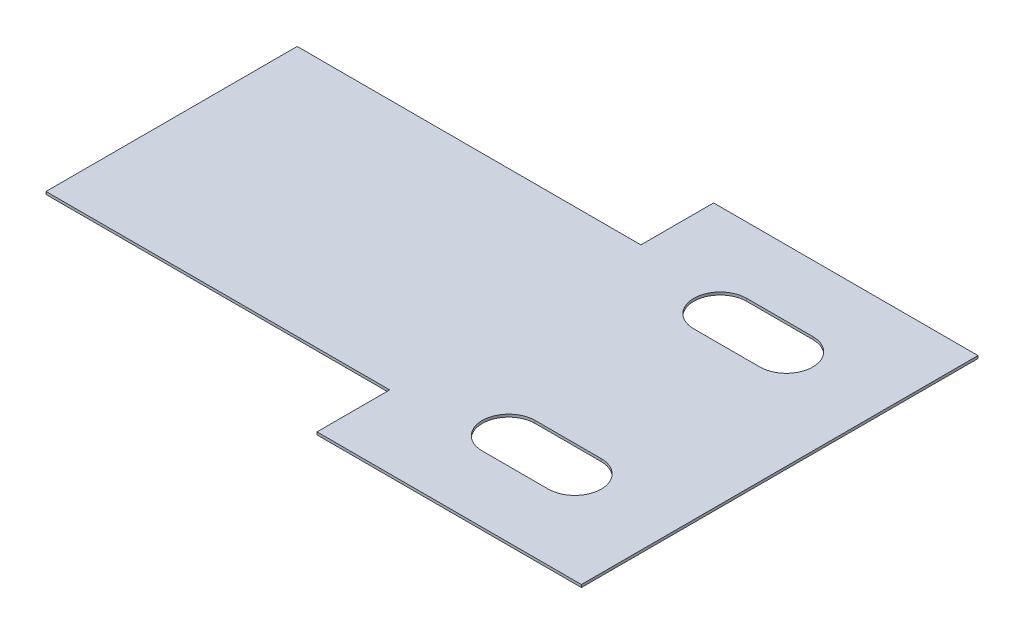
ISO-10303-21;
HEADER;
FILE_DESCRIPTION(('STEP AP214'),'2;1');
FILE_NAME('part.step','',(''),(''),'','','');
FILE_SCHEMA(('AUTOMOTIVE_DESIGN { 1 0 10303 214 1 1 1 1 }'));
ENDSEC;
DATA;
#1=APPLICATION_CONTEXT('core data for automotive mechanical design processes');
#2=APPLICATION_PROTOCOL_DEFINITION('international standard','automotive_design',2000,#1);
#3=PRODUCT_CONTEXT('',#1,'mechanical');
#4=PRODUCT('Part','Part','',(#3));
#5=PRODUCT_RELATED_PRODUCT_CATEGORY('part','',(#4));
#6=PRODUCT_DEFINITION_FORMATION('','',#4);
#7=PRODUCT_DEFINITION_CONTEXT('part definition',#1,'design');
#8=PRODUCT_DEFINITION('design','',#6,#7);
#9=PRODUCT_DEFINITION_SHAPE('','',#8);
#10=(LENGTH_UNIT() NAMED_UNIT(*) SI_UNIT(.MILLI.,.METRE.));
#11=(NAMED_UNIT(*) PLANE_ANGLE_UNIT() SI_UNIT($,.RADIAN.));
#12=(NAMED_UNIT(*) SI_UNIT($,.STERADIAN.) SOLID_ANGLE_UNIT());
#13=UNCERTAINTY_MEASURE_WITH_UNIT(LENGTH_MEASURE(1.E-05),#10,'distance_accuracy_value','');
#14=(GEOMETRIC_REPRESENTATION_CONTEXT(3) GLOBAL_UNCERTAINTY_ASSIGNED_CONTEXT((#13)) GLOBAL_UNIT_ASSIGNED_CONTEXT((#10,
#11,#12)) REPRESENTATION_CONTEXT('',''));
#15=CARTESIAN_POINT('',(0.,0.,0.));
#16=DIRECTION('',(0.,0.,1.));
#17=DIRECTION('',(1.,0.,0.));
#18=AXIS2_PLACEMENT_3D('',#15,#16,#17);
#19=CARTESIAN_POINT('',(0.,0.05,0.));
#20=DIRECTION('',(0.,1.,0.));
#21=DIRECTION('',(0.,0.,1.));
#22=AXIS2_PLACEMENT_3D('',#19,#20,#21);
#23=PLANE('',#22);
#24=DIRECTION('',(0.,0.,1.));
#25=VECTOR('',#24,1.);
#26=CARTESIAN_POINT('',(-6.77881475280006,0.05,-3.71273882483503));
#27=LINE('',#26,#25);
#28=CARTESIAN_POINT('',(-6.77881475280006,0.05,-3.71273882483503));
#29=VERTEX_POINT('',#28);
#30=CARTESIAN_POINT('',(-6.77881475280006,0.05,5.78726117516497));
#31=VERTEX_POINT('',#30);
#32=EDGE_CURVE('E244',#29,#31,#27,.T.);
#33=ORIENTED_EDGE('',*,*,#32,.T.);
#34=DIRECTION('',(1.,0.,0.));
#35=VECTOR('',#34,1.);
#36=CARTESIAN_POINT('',(-6.77881475280006,0.05,5.78726117516497));
#37=LINE('',#36,#35);
#38=CARTESIAN_POINT('',(6.22118524719994,0.05,5.78726117516497));
#39=VERTEX_POINT('',#38);
#40=EDGE_CURVE('E248',#31,#39,#37,.T.);
#41=ORIENTED_EDGE('',*,*,#40,.T.);
#42=DIRECTION('',(0.,0.,1.));
#43=VECTOR('',#42,1.);
#44=CARTESIAN_POINT('',(6.22118524719994,0.05,5.78726117516497));
#45=LINE('',#44,#43);
#46=CARTESIAN_POINT('',(6.22118524719994,0.05,8.53726117516497));
#47=VERTEX_POINT('',#46);
#48=EDGE_CURVE('E252',#39,#47,#45,.T.);
#49=ORIENTED_EDGE('',*,*,#48,.T.);
#50=DIRECTION('',(1.,0.,0.));
#51=VECTOR('',#50,1.);
#52=CARTESIAN_POINT('',(6.22118524719994,0.05,8.53726117516497));
#53=LINE('',#52,#51);
#54=CARTESIAN_POINT('',(16.2211852471999,0.05,8.53726117516497));
#55=VERTEX_POINT('',#54);
#56=EDGE_CURVE('E255',#47,#55,#53,.T.);
#57=ORIENTED_EDGE('',*,*,#56,.T.);
#58=DIRECTION('',(0.,0.,-1.));
#59=VECTOR('',#58,1.);
#60=CARTESIAN_POINT('',(16.2211852471999,0.05,8.53726117516497));
#61=LINE('',#60,#59);
#62=CARTESIAN_POINT('',(16.2211852471999,0.05,-6.46273882483503));
#63=VERTEX_POINT('',#62);
#64=EDGE_CURVE('E258',#55,#63,#61,.T.);
#65=ORIENTED_EDGE('',*,*,#64,.T.);
#66=DIRECTION('',(-1.,0.,0.));
#67=VECTOR('',#66,1.);
#68=CARTESIAN_POINT('',(16.2211852471999,0.05,-6.46273882483503));
#69=LINE('',#68,#67);
#70=CARTESIAN_POINT('',(6.22118524719994,0.05,-6.46273882483503));
#71=VERTEX_POINT('',#70);
#72=EDGE_CURVE('E261',#63,#71,#69,.T.);
#73=ORIENTED_EDGE('',*,*,#72,.T.);
#74=DIRECTION('',(0.,0.,1.));
#75=VECTOR('',#74,1.);
#76=CARTESIAN_POINT('',(6.22118524719994,0.05,-6.46273882483503));
#77=LINE('',#76,#75);
#78=CARTESIAN_POINT('',(6.22118524719994,0.05,-3.71273882483503));
#79=VERTEX_POINT('',#78);
#80=EDGE_CURVE('E264',#71,#79,#77,.T.);
#81=ORIENTED_EDGE('',*,*,#80,.T.);
#82=DIRECTION('',(-1.,0.,0.));
#83=VECTOR('',#82,1.);
#84=CARTESIAN_POINT('',(6.22118524719994,0.05,-3.71273882483503));
#85=LINE('',#84,#83);
#86=EDGE_CURVE('E267',#79,#29,#85,.T.);
#87=ORIENTED_EDGE('',*,*,#86,.T.);
#88=EDGE_LOOP('',(#33,#41,#49,#57,#65,#73,#81,#87));
#89=FACE_BOUND('',#88,.T.);
#90=DIRECTION('',(-1.,0.,0.));
#91=VECTOR('',#90,1.);
#92=CARTESIAN_POINT('',(12.4711852471999,0.05,-3.96273882483504));
#93=LINE('',#92,#91);
#94=CARTESIAN_POINT('',(12.4711852471999,0.05,-3.96273882483504));
#95=VERTEX_POINT('',#94);
#96=CARTESIAN_POINT('',(9.97118524719994,0.05,-3.96273882483504));
#97=VERTEX_POINT('',#96);
#98=EDGE_CURVE('E204',#95,#97,#93,.T.);
#99=ORIENTED_EDGE('',*,*,#98,.F.);
#100=CARTESIAN_POINT('',(12.4711852471999,0.05,-2.96273882483504));
#101=DIRECTION('',(0.,1.,0.));
#102=DIRECTION('',(0.,0.,1.));
#103=AXIS2_PLACEMENT_3D('',#100,#101,#102);
#104=CIRCLE('',#103,1.);
#105=CARTESIAN_POINT('',(12.4711852471999,0.05,-1.96273882483503));
#106=VERTEX_POINT('',#105);
#107=EDGE_CURVE('E201',#106,#95,#104,.T.);
#108=ORIENTED_EDGE('',*,*,#107,.F.);
#109=DIRECTION('',(1.,0.,0.));
#110=VECTOR('',#109,1.);
#111=CARTESIAN_POINT('',(9.97118524719994,0.05,-1.96273882483503));
#112=LINE('',#111,#110);
#113=CARTESIAN_POINT('',(9.97118524719994,0.05,-1.96273882483503));
#114=VERTEX_POINT('',#113);
#115=EDGE_CURVE('E212',#114,#106,#112,.T.);
#116=ORIENTED_EDGE('',*,*,#115,.F.);
#117=CARTESIAN_POINT('',(9.97118524719994,0.05,-2.96273882483504));
#118=DIRECTION('',(0.,1.,0.));
#119=DIRECTION('',(0.,0.,1.));
#120=AXIS2_PLACEMENT_3D('',#117,#118,#119);
#121=CIRCLE('',#120,1.);
#122=EDGE_CURVE('E208',#97,#114,#121,.T.);
#123=ORIENTED_EDGE('',*,*,#122,.F.);
#124=EDGE_LOOP('',(#99,#108,#116,#123));
#125=FACE_BOUND('',#124,.T.);
#126=DIRECTION('',(-1.,0.,0.));
#127=VECTOR('',#126,1.);
#128=CARTESIAN_POINT('',(12.4711852471999,0.05,4.03726117516496));
#129=LINE('',#128,#127);
#130=CARTESIAN_POINT('',(12.4711852471999,0.05,4.03726117516496));
#131=VERTEX_POINT('',#130);
#132=CARTESIAN_POINT('',(9.97118524719994,0.05,4.03726117516497));
#133=VERTEX_POINT('',#132);
#134=EDGE_CURVE('E162',#131,#133,#129,.T.);
#135=ORIENTED_EDGE('',*,*,#134,.F.);
#136=CARTESIAN_POINT('',(12.4711852471999,0.05,5.03726117516497));
#137=DIRECTION('',(0.,1.,0.));
#138=DIRECTION('',(0.,0.,1.));
#139=AXIS2_PLACEMENT_3D('',#136,#137,#138);
#140=CIRCLE('',#139,1.);
#141=CARTESIAN_POINT('',(12.4711852471999,0.05,6.03726117516497));
#142=VERTEX_POINT('',#141);
#143=EDGE_CURVE('E153',#142,#131,#140,.T.);
#144=ORIENTED_EDGE('',*,*,#143,.F.);
#145=DIRECTION('',(1.,0.,0.));
#146=VECTOR('',#145,1.);
#147=CARTESIAN_POINT('',(9.97118524719994,0.05,6.03726117516497));
#148=LINE('',#147,#146);
#149=CARTESIAN_POINT('',(9.97118524719994,0.05,6.03726117516497));
#150=VERTEX_POINT('',#149);
#151=EDGE_CURVE('E179',#150,#142,#148,.T.);
#152=ORIENTED_EDGE('',*,*,#151,.F.);
#153=CARTESIAN_POINT('',(9.97118524719994,0.05,5.03726117516497));
#154=DIRECTION('',(0.,1.,0.));
#155=DIRECTION('',(0.,0.,1.));
#156=AXIS2_PLACEMENT_3D('',#153,#154,#155);
#157=CIRCLE('',#156,1.);
#158=EDGE_CURVE('E175',#133,#150,#157,.T.);
#159=ORIENTED_EDGE('',*,*,#158,.F.);
#160=EDGE_LOOP('',(#135,#144,#152,#159));
#161=FACE_BOUND('',#160,.T.);
#162=ADVANCED_FACE('F39',(#89,#125,#161),#23,.T.);
#163=CARTESIAN_POINT('',(0.,-0.05,0.));
#164=DIRECTION('',(0.,1.,0.));
#165=DIRECTION('',(0.,0.,1.));
#166=AXIS2_PLACEMENT_3D('',#163,#164,#165);
#167=PLANE('',#166);
#168=CARTESIAN_POINT('',(12.4711852471999,-0.05,-2.96273882483504));
#169=DIRECTION('',(0.,1.,0.));
#170=DIRECTION('',(0.,0.,1.));
#171=AXIS2_PLACEMENT_3D('',#168,#169,#170);
#172=CIRCLE('',#171,1.);
#173=CARTESIAN_POINT('',(12.4711852471999,-0.05,-1.96273882483503));
#174=VERTEX_POINT('',#173);
#175=CARTESIAN_POINT('',(12.4711852471999,-0.05,-3.96273882483504));
#176=VERTEX_POINT('',#175);
#177=EDGE_CURVE('E171',#174,#176,#172,.T.);
#178=ORIENTED_EDGE('',*,*,#177,.T.);
#179=DIRECTION('',(-1.,0.,0.));
#180=VECTOR('',#179,1.);
#181=CARTESIAN_POINT('',(12.4711852471999,-0.05,-3.96273882483504));
#182=LINE('',#181,#180);
#183=CARTESIAN_POINT('',(9.97118524719994,-0.05,-3.96273882483504));
#184=VERTEX_POINT('',#183);
#185=EDGE_CURVE('E219',#176,#184,#182,.T.);
#186=ORIENTED_EDGE('',*,*,#185,.T.);
#187=CARTESIAN_POINT('',(9.97118524719994,-0.05,-2.96273882483504));
#188=DIRECTION('',(0.,1.,0.));
#189=DIRECTION('',(0.,0.,1.));
#190=AXIS2_PLACEMENT_3D('',#187,#188,#189);
#191=CIRCLE('',#190,1.);
#192=CARTESIAN_POINT('',(9.97118524719994,-0.05,-1.96273882483503));
#193=VERTEX_POINT('',#192);
#194=EDGE_CURVE('E223',#184,#193,#191,.T.);
#195=ORIENTED_EDGE('',*,*,#194,.T.);
#196=DIRECTION('',(1.,0.,0.));
#197=VECTOR('',#196,1.);
#198=CARTESIAN_POINT('',(9.97118524719994,-0.05,-1.96273882483503));
#199=LINE('',#198,#197);
#200=EDGE_CURVE('E205',#193,#174,#199,.T.);
#201=ORIENTED_EDGE('',*,*,#200,.T.);
#202=EDGE_LOOP('',(#178,#186,#195,#201));
#203=FACE_BOUND('',#202,.T.);
#204=DIRECTION('',(0.,0.,1.));
#205=VECTOR('',#204,1.);
#206=CARTESIAN_POINT('',(-6.77881475280006,-0.05,-3.71273882483503));
#207=LINE('',#206,#205);
#208=CARTESIAN_POINT('',(-6.77881475280006,-0.05,-3.71273882483503));
#209=VERTEX_POINT('',#208);
#210=CARTESIAN_POINT('',(-6.77881475280006,-0.05,5.78726117516497));
#211=VERTEX_POINT('',#210);
#212=EDGE_CURVE('E243',#209,#211,#207,.T.);
#213=ORIENTED_EDGE('',*,*,#212,.F.);
#214=DIRECTION('',(-1.,0.,0.));
#215=VECTOR('',#214,1.);
#216=CARTESIAN_POINT('',(6.22118524719994,-0.05,-3.71273882483503));
#217=LINE('',#216,#215);
#218=CARTESIAN_POINT('',(6.22118524719994,-0.05,-3.71273882483503));
#219=VERTEX_POINT('',#218);
#220=EDGE_CURVE('E249',#219,#209,#217,.T.);
#221=ORIENTED_EDGE('',*,*,#220,.F.);
#222=DIRECTION('',(0.,0.,1.));
#223=VECTOR('',#222,1.);
#224=CARTESIAN_POINT('',(6.22118524719994,-0.05,-6.46273882483503));
#225=LINE('',#224,#223);
#226=CARTESIAN_POINT('',(6.22118524719994,-0.05,-6.46273882483503));
#227=VERTEX_POINT('',#226);
#228=EDGE_CURVE('E289',#227,#219,#225,.T.);
#229=ORIENTED_EDGE('',*,*,#228,.F.);
#230=DIRECTION('',(-1.,0.,0.));
#231=VECTOR('',#230,1.);
#232=CARTESIAN_POINT('',(16.2211852471999,-0.05,-6.46273882483503));
#233=LINE('',#232,#231);
#234=CARTESIAN_POINT('',(16.2211852471999,-0.05,-6.46273882483503));
#235=VERTEX_POINT('',#234);
#236=EDGE_CURVE('E286',#235,#227,#233,.T.);
#237=ORIENTED_EDGE('',*,*,#236,.F.);
#238=DIRECTION('',(0.,0.,-1.));
#239=VECTOR('',#238,1.);
#240=CARTESIAN_POINT('',(16.2211852471999,-0.05,8.53726117516497));
#241=LINE('',#240,#239);
#242=CARTESIAN_POINT('',(16.2211852471999,-0.05,8.53726117516497));
#243=VERTEX_POINT('',#242);
#244=EDGE_CURVE('E283',#243,#235,#241,.T.);
#245=ORIENTED_EDGE('',*,*,#244,.F.);
#246=DIRECTION('',(1.,0.,0.));
#247=VECTOR('',#246,1.);
#248=CARTESIAN_POINT('',(6.22118524719994,-0.05,8.53726117516497));
#249=LINE('',#248,#247);
#250=CARTESIAN_POINT('',(6.22118524719994,-0.05,8.53726117516497));
#251=VERTEX_POINT('',#250);
#252=EDGE_CURVE('E280',#251,#243,#249,.T.);
#253=ORIENTED_EDGE('',*,*,#252,.F.);
#254=DIRECTION('',(0.,0.,1.));
#255=VECTOR('',#254,1.);
#256=CARTESIAN_POINT('',(6.22118524719994,-0.05,5.78726117516497));
#257=LINE('',#256,#255);
#258=CARTESIAN_POINT('',(6.22118524719994,-0.05,5.78726117516497));
#259=VERTEX_POINT('',#258);
#260=EDGE_CURVE('E277',#259,#251,#257,.T.);
#261=ORIENTED_EDGE('',*,*,#260,.F.);
#262=DIRECTION('',(1.,0.,0.));
#263=VECTOR('',#262,1.);
#264=CARTESIAN_POINT('',(-6.77881475280006,-0.05,5.78726117516497));
#265=LINE('',#264,#263);
#266=EDGE_CURVE('E274',#211,#259,#265,.T.);
#267=ORIENTED_EDGE('',*,*,#266,.F.);
#268=EDGE_LOOP('',(#213,#221,#229,#237,#245,#253,#261,#267));
#269=FACE_BOUND('',#268,.T.);
#270=CARTESIAN_POINT('',(12.4711852471999,-0.05,5.03726117516497));
#271=DIRECTION('',(0.,1.,0.));
#272=DIRECTION('',(0.,0.,1.));
#273=AXIS2_PLACEMENT_3D('',#270,#271,#272);
#274=CIRCLE('',#273,1.);
#275=CARTESIAN_POINT('',(12.4711852471999,-0.05,6.03726117516497));
#276=VERTEX_POINT('',#275);
#277=CARTESIAN_POINT('',(12.4711852471999,-0.05,4.03726117516496));
#278=VERTEX_POINT('',#277);
#279=EDGE_CURVE('E63',#276,#278,#274,.T.);
#280=ORIENTED_EDGE('',*,*,#279,.T.);
#281=DIRECTION('',(-1.,0.,0.));
#282=VECTOR('',#281,1.);
#283=CARTESIAN_POINT('',(12.4711852471999,-0.05,4.03726117516496));
#284=LINE('',#283,#282);
#285=CARTESIAN_POINT('',(9.97118524719994,-0.05,4.03726117516497));
#286=VERTEX_POINT('',#285);
#287=EDGE_CURVE('E169',#278,#286,#284,.T.);
#288=ORIENTED_EDGE('',*,*,#287,.T.);
#289=CARTESIAN_POINT('',(9.97118524719994,-0.05,5.03726117516497));
#290=DIRECTION('',(0.,1.,0.));
#291=DIRECTION('',(0.,0.,1.));
#292=AXIS2_PLACEMENT_3D('',#289,#290,#291);
#293=CIRCLE('',#292,1.);
#294=CARTESIAN_POINT('',(9.97118524719994,-0.05,6.03726117516497));
#295=VERTEX_POINT('',#294);
#296=EDGE_CURVE('E188',#286,#295,#293,.T.);
#297=ORIENTED_EDGE('',*,*,#296,.T.);
#298=DIRECTION('',(1.,0.,0.));
#299=VECTOR('',#298,1.);
#300=CARTESIAN_POINT('',(9.97118524719994,-0.05,6.03726117516497));
#301=LINE('',#300,#299);
#302=EDGE_CURVE('E163',#295,#276,#301,.T.);
#303=ORIENTED_EDGE('',*,*,#302,.T.);
#304=EDGE_LOOP('',(#280,#288,#297,#303));
#305=FACE_BOUND('',#304,.T.);
#306=ADVANCED_FACE('F328',(#203,#269,#305),#167,.F.);
#307=CARTESIAN_POINT('',(-6.77881475280006,0.05,-3.71273882483503));
#308=DIRECTION('',(1.,0.,0.));
#309=DIRECTION('',(0.,0.,-1.));
#310=AXIS2_PLACEMENT_3D('',#307,#308,#309);
#311=PLANE('',#310);
#312=ORIENTED_EDGE('',*,*,#212,.T.);
#313=DIRECTION('',(0.,-1.,0.));
#314=VECTOR('',#313,1.);
#315=CARTESIAN_POINT('',(-6.77881475280006,0.05,5.78726117516497));
#316=LINE('',#315,#314);
#317=EDGE_CURVE('E11',#31,#211,#316,.T.);
#318=ORIENTED_EDGE('',*,*,#317,.F.);
#319=ORIENTED_EDGE('',*,*,#32,.F.);
#320=DIRECTION('',(0.,-1.,0.));
#321=VECTOR('',#320,1.);
#322=CARTESIAN_POINT('',(-6.77881475280006,0.05,-3.71273882483503));
#323=LINE('',#322,#321);
#324=EDGE_CURVE('E270',#29,#209,#323,.T.);
#325=ORIENTED_EDGE('',*,*,#324,.T.);
#326=EDGE_LOOP('',(#312,#318,#319,#325));
#327=FACE_BOUND('',#326,.T.);
#328=ADVANCED_FACE('F41',(#327),#311,.F.);
#329=CARTESIAN_POINT('',(-6.77881475280006,0.05,5.78726117516497));
#330=DIRECTION('',(0.,0.,-1.));
#331=DIRECTION('',(-1.,0.,0.));
#332=AXIS2_PLACEMENT_3D('',#329,#330,#331);
#333=PLANE('',#332);
#334=ORIENTED_EDGE('',*,*,#266,.T.);
#335=DIRECTION('',(0.,-1.,0.));
#336=VECTOR('',#335,1.);
#337=CARTESIAN_POINT('',(6.22118524719994,0.05,5.78726117516497));
#338=LINE('',#337,#336);
#339=EDGE_CURVE('E48',#39,#259,#338,.T.);
#340=ORIENTED_EDGE('',*,*,#339,.F.);
#341=ORIENTED_EDGE('',*,*,#40,.F.);
#342=ORIENTED_EDGE('',*,*,#317,.T.);
#343=EDGE_LOOP('',(#334,#340,#341,#342));
#344=FACE_BOUND('',#343,.T.);
#345=ADVANCED_FACE('F346',(#344),#333,.F.);
#346=CARTESIAN_POINT('',(6.22118524719994,0.05,5.78726117516497));
#347=DIRECTION('',(1.,0.,0.));
#348=DIRECTION('',(0.,0.,-1.));
#349=AXIS2_PLACEMENT_3D('',#346,#347,#348);
#350=PLANE('',#349);
#351=ORIENTED_EDGE('',*,*,#260,.T.);
#352=DIRECTION('',(0.,-1.,0.));
#353=VECTOR('',#352,1.);
#354=CARTESIAN_POINT('',(6.22118524719994,0.05,8.53726117516497));
#355=LINE('',#354,#353);
#356=EDGE_CURVE('E313',#47,#251,#355,.T.);
#357=ORIENTED_EDGE('',*,*,#356,.F.);
#358=ORIENTED_EDGE('',*,*,#48,.F.);
#359=ORIENTED_EDGE('',*,*,#339,.T.);
#360=EDGE_LOOP('',(#351,#357,#358,#359));
#361=FACE_BOUND('',#360,.T.);
#362=ADVANCED_FACE('F322',(#361),#350,.F.);
#363=CARTESIAN_POINT('',(6.22118524719994,0.05,8.53726117516497));
#364=DIRECTION('',(0.,0.,-1.));
#365=DIRECTION('',(-1.,0.,0.));
#366=AXIS2_PLACEMENT_3D('',#363,#364,#365);
#367=PLANE('',#366);
#368=ORIENTED_EDGE('',*,*,#252,.T.);
#369=DIRECTION('',(0.,-1.,0.));
#370=VECTOR('',#369,1.);
#371=CARTESIAN_POINT('',(16.2211852471999,0.05,8.53726117516497));
#372=LINE('',#371,#370);
#373=EDGE_CURVE('E309',#55,#243,#372,.T.);
#374=ORIENTED_EDGE('',*,*,#373,.F.);
#375=ORIENTED_EDGE('',*,*,#56,.F.);
#376=ORIENTED_EDGE('',*,*,#356,.T.);
#377=EDGE_LOOP('',(#368,#374,#375,#376));
#378=FACE_BOUND('',#377,.T.);
#379=ADVANCED_FACE('F334',(#378),#367,.F.);
#380=CARTESIAN_POINT('',(16.2211852471999,0.05,8.53726117516497));
#381=DIRECTION('',(-1.,0.,0.));
#382=DIRECTION('',(0.,0.,1.));
#383=AXIS2_PLACEMENT_3D('',#380,#381,#382);
#384=PLANE('',#383);
#385=ORIENTED_EDGE('',*,*,#244,.T.);
#386=DIRECTION('',(0.,-1.,0.));
#387=VECTOR('',#386,1.);
#388=CARTESIAN_POINT('',(16.2211852471999,0.05,-6.46273882483503));
#389=LINE('',#388,#387);
#390=EDGE_CURVE('E305',#63,#235,#389,.T.);
#391=ORIENTED_EDGE('',*,*,#390,.F.);
#392=ORIENTED_EDGE('',*,*,#64,.F.);
#393=ORIENTED_EDGE('',*,*,#373,.T.);
#394=EDGE_LOOP('',(#385,#391,#392,#393));
#395=FACE_BOUND('',#394,.T.);
#396=ADVANCED_FACE('F338',(#395),#384,.F.);
#397=CARTESIAN_POINT('',(16.2211852471999,0.05,-6.46273882483503));
#398=DIRECTION('',(0.,0.,1.));
#399=DIRECTION('',(1.,0.,0.));
#400=AXIS2_PLACEMENT_3D('',#397,#398,#399);
#401=PLANE('',#400);
#402=ORIENTED_EDGE('',*,*,#236,.T.);
#403=DIRECTION('',(0.,-1.,0.));
#404=VECTOR('',#403,1.);
#405=CARTESIAN_POINT('',(6.22118524719994,0.05,-6.46273882483503));
#406=LINE('',#405,#404);
#407=EDGE_CURVE('E301',#71,#227,#406,.T.);
#408=ORIENTED_EDGE('',*,*,#407,.F.);
#409=ORIENTED_EDGE('',*,*,#72,.F.);
#410=ORIENTED_EDGE('',*,*,#390,.T.);
#411=EDGE_LOOP('',(#402,#408,#409,#410));
#412=FACE_BOUND('',#411,.T.);
#413=ADVANCED_FACE('F359',(#412),#401,.F.);
#414=CARTESIAN_POINT('',(6.22118524719994,0.05,-6.46273882483503));
#415=DIRECTION('',(1.,0.,0.));
#416=DIRECTION('',(0.,0.,-1.));
#417=AXIS2_PLACEMENT_3D('',#414,#415,#416);
#418=PLANE('',#417);
#419=ORIENTED_EDGE('',*,*,#228,.T.);
#420=DIRECTION('',(0.,-1.,0.));
#421=VECTOR('',#420,1.);
#422=CARTESIAN_POINT('',(6.22118524719994,0.05,-3.71273882483503));
#423=LINE('',#422,#421);
#424=EDGE_CURVE('E297',#79,#219,#423,.T.);
#425=ORIENTED_EDGE('',*,*,#424,.F.);
#426=ORIENTED_EDGE('',*,*,#80,.F.);
#427=ORIENTED_EDGE('',*,*,#407,.T.);
#428=EDGE_LOOP('',(#419,#425,#426,#427));
#429=FACE_BOUND('',#428,.T.);
#430=ADVANCED_FACE('F357',(#429),#418,.F.);
#431=CARTESIAN_POINT('',(6.22118524719994,0.05,-3.71273882483503));
#432=DIRECTION('',(0.,0.,1.));
#433=DIRECTION('',(1.,0.,0.));
#434=AXIS2_PLACEMENT_3D('',#431,#432,#433);
#435=PLANE('',#434);
#436=ORIENTED_EDGE('',*,*,#220,.T.);
#437=ORIENTED_EDGE('',*,*,#324,.F.);
#438=ORIENTED_EDGE('',*,*,#86,.F.);
#439=ORIENTED_EDGE('',*,*,#424,.T.);
#440=EDGE_LOOP('',(#436,#437,#438,#439));
#441=FACE_BOUND('',#440,.T.);
#442=ADVANCED_FACE('F352',(#441),#435,.F.);
#443=CARTESIAN_POINT('',(12.4711852471999,0.05,-2.96273882483504));
#444=DIRECTION('',(0.,-1.,0.));
#445=DIRECTION('',(0.,0.,-1.));
#446=AXIS2_PLACEMENT_3D('',#443,#444,#445);
#447=CYLINDRICAL_SURFACE('',#446,1.);
#448=ORIENTED_EDGE('',*,*,#177,.F.);
#449=DIRECTION('',(0.,-1.,0.));
#450=VECTOR('',#449,1.);
#451=CARTESIAN_POINT('',(12.4711852471999,0.05,-1.96273882483503));
#452=LINE('',#451,#450);
#453=EDGE_CURVE('E215',#106,#174,#452,.T.);
#454=ORIENTED_EDGE('',*,*,#453,.F.);
#455=ORIENTED_EDGE('',*,*,#107,.T.);
#456=DIRECTION('',(0.,-1.,0.));
#457=VECTOR('',#456,1.);
#458=CARTESIAN_POINT('',(12.4711852471999,0.05,-3.96273882483504));
#459=LINE('',#458,#457);
#460=EDGE_CURVE('E239',#95,#176,#459,.T.);
#461=ORIENTED_EDGE('',*,*,#460,.T.);
#462=EDGE_LOOP('',(#448,#454,#455,#461));
#463=FACE_BOUND('',#462,.T.);
#464=ADVANCED_FACE('F376',(#463),#447,.F.);
#465=CARTESIAN_POINT('',(12.4711852471999,0.05,-3.96273882483504));
#466=DIRECTION('',(0.,0.,1.));
#467=DIRECTION('',(1.,0.,0.));
#468=AXIS2_PLACEMENT_3D('',#465,#466,#467);
#469=PLANE('',#468);
#470=ORIENTED_EDGE('',*,*,#185,.F.);
#471=ORIENTED_EDGE('',*,*,#460,.F.);
#472=ORIENTED_EDGE('',*,*,#98,.T.);
#473=DIRECTION('',(0.,-1.,0.));
#474=VECTOR('',#473,1.);
#475=CARTESIAN_POINT('',(9.97118524719994,0.05,-3.96273882483504));
#476=LINE('',#475,#474);
#477=EDGE_CURVE('E236',#97,#184,#476,.T.);
#478=ORIENTED_EDGE('',*,*,#477,.T.);
#479=EDGE_LOOP('',(#470,#471,#472,#478));
#480=FACE_BOUND('',#479,.T.);
#481=ADVANCED_FACE('F383',(#480),#469,.T.);
#482=CARTESIAN_POINT('',(9.97118524719994,0.05,-2.96273882483504));
#483=DIRECTION('',(0.,-1.,0.));
#484=DIRECTION('',(0.,0.,-1.));
#485=AXIS2_PLACEMENT_3D('',#482,#483,#484);
#486=CYLINDRICAL_SURFACE('',#485,1.);
#487=ORIENTED_EDGE('',*,*,#194,.F.);
#488=ORIENTED_EDGE('',*,*,#477,.F.);
#489=ORIENTED_EDGE('',*,*,#122,.T.);
#490=DIRECTION('',(0.,-1.,0.));
#491=VECTOR('',#490,1.);
#492=CARTESIAN_POINT('',(9.97118524719994,0.05,-1.96273882483503));
#493=LINE('',#492,#491);
#494=EDGE_CURVE('E233',#114,#193,#493,.T.);
#495=ORIENTED_EDGE('',*,*,#494,.T.);
#496=EDGE_LOOP('',(#487,#488,#489,#495));
#497=FACE_BOUND('',#496,.T.);
#498=ADVANCED_FACE('F388',(#497),#486,.F.);
#499=CARTESIAN_POINT('',(9.97118524719994,0.05,-1.96273882483503));
#500=DIRECTION('',(0.,0.,-1.));
#501=DIRECTION('',(-1.,0.,0.));
#502=AXIS2_PLACEMENT_3D('',#499,#500,#501);
#503=PLANE('',#502);
#504=ORIENTED_EDGE('',*,*,#200,.F.);
#505=ORIENTED_EDGE('',*,*,#494,.F.);
#506=ORIENTED_EDGE('',*,*,#115,.T.);
#507=ORIENTED_EDGE('',*,*,#453,.T.);
#508=EDGE_LOOP('',(#504,#505,#506,#507));
#509=FACE_BOUND('',#508,.T.);
#510=ADVANCED_FACE('F395',(#509),#503,.T.);
#511=CARTESIAN_POINT('',(12.4711852471999,0.05,5.03726117516497));
#512=DIRECTION('',(0.,-1.,0.));
#513=DIRECTION('',(0.,0.,-1.));
#514=AXIS2_PLACEMENT_3D('',#511,#512,#513);
#515=CYLINDRICAL_SURFACE('',#514,1.);
#516=ORIENTED_EDGE('',*,*,#279,.F.);
#517=DIRECTION('',(0.,-1.,0.));
#518=VECTOR('',#517,1.);
#519=CARTESIAN_POINT('',(12.4711852471999,0.05,6.03726117516497));
#520=LINE('',#519,#518);
#521=EDGE_CURVE('E157',#142,#276,#520,.T.);
#522=ORIENTED_EDGE('',*,*,#521,.F.);
#523=ORIENTED_EDGE('',*,*,#143,.T.);
#524=DIRECTION('',(0.,-1.,0.));
#525=VECTOR('',#524,1.);
#526=CARTESIAN_POINT('',(12.4711852471999,0.05,4.03726117516496));
#527=LINE('',#526,#525);
#528=EDGE_CURVE('E156',#131,#278,#527,.T.);
#529=ORIENTED_EDGE('',*,*,#528,.T.);
#530=EDGE_LOOP('',(#516,#522,#523,#529));
#531=FACE_BOUND('',#530,.T.);
#532=ADVANCED_FACE('F155',(#531),#515,.F.);
#533=CARTESIAN_POINT('',(12.4711852471999,0.05,4.03726117516496));
#534=DIRECTION('',(0.,0.,1.));
#535=DIRECTION('',(1.,0.,0.));
#536=AXIS2_PLACEMENT_3D('',#533,#534,#535);
#537=PLANE('',#536);
#538=ORIENTED_EDGE('',*,*,#287,.F.);
#539=ORIENTED_EDGE('',*,*,#528,.F.);
#540=ORIENTED_EDGE('',*,*,#134,.T.);
#541=DIRECTION('',(0.,-1.,0.));
#542=VECTOR('',#541,1.);
#543=CARTESIAN_POINT('',(9.97118524719994,0.05,4.03726117516497));
#544=LINE('',#543,#542);
#545=EDGE_CURVE('E172',#133,#286,#544,.T.);
#546=ORIENTED_EDGE('',*,*,#545,.T.);
#547=EDGE_LOOP('',(#538,#539,#540,#546));
#548=FACE_BOUND('',#547,.T.);
#549=ADVANCED_FACE('F166',(#548),#537,.T.);
#550=CARTESIAN_POINT('',(9.97118524719994,0.05,5.03726117516497));
#551=DIRECTION('',(0.,-1.,0.));
#552=DIRECTION('',(0.,0.,-1.));
#553=AXIS2_PLACEMENT_3D('',#550,#551,#552);
#554=CYLINDRICAL_SURFACE('',#553,1.);
#555=ORIENTED_EDGE('',*,*,#296,.F.);
#556=ORIENTED_EDGE('',*,*,#545,.F.);
#557=ORIENTED_EDGE('',*,*,#158,.T.);
#558=DIRECTION('',(0.,-1.,0.));
#559=VECTOR('',#558,1.);
#560=CARTESIAN_POINT('',(9.97118524719994,0.05,6.03726117516497));
#561=LINE('',#560,#559);
#562=EDGE_CURVE('E55',#150,#295,#561,.T.);
#563=ORIENTED_EDGE('',*,*,#562,.T.);
#564=EDGE_LOOP('',(#555,#556,#557,#563));
#565=FACE_BOUND('',#564,.T.);
#566=ADVANCED_FACE('F413',(#565),#554,.F.);
#567=CARTESIAN_POINT('',(9.97118524719994,0.05,6.03726117516497));
#568=DIRECTION('',(0.,0.,-1.));
#569=DIRECTION('',(-1.,0.,0.));
#570=AXIS2_PLACEMENT_3D('',#567,#568,#569);
#571=PLANE('',#570);
#572=ORIENTED_EDGE('',*,*,#302,.F.);
#573=ORIENTED_EDGE('',*,*,#562,.F.);
#574=ORIENTED_EDGE('',*,*,#151,.T.);
#575=ORIENTED_EDGE('',*,*,#521,.T.);
#576=EDGE_LOOP('',(#572,#573,#574,#575));
#577=FACE_BOUND('',#576,.T.);
#578=ADVANCED_FACE('F416',(#577),#571,.T.);
#579=CLOSED_SHELL('',(#162,#306,#328,#345,#362,#379,#396,#413,#430,#442,#464,#481,#498,#510,
#532,#549,#566,#578));
#580=MANIFOLD_SOLID_BREP('B2',#579);
#581=ADVANCED_BREP_SHAPE_REPRESENTATION('',(#18,#580),#14);
#582=SHAPE_DEFINITION_REPRESENTATION(#9,#581);
ENDSEC;
END-ISO-10303-21;
